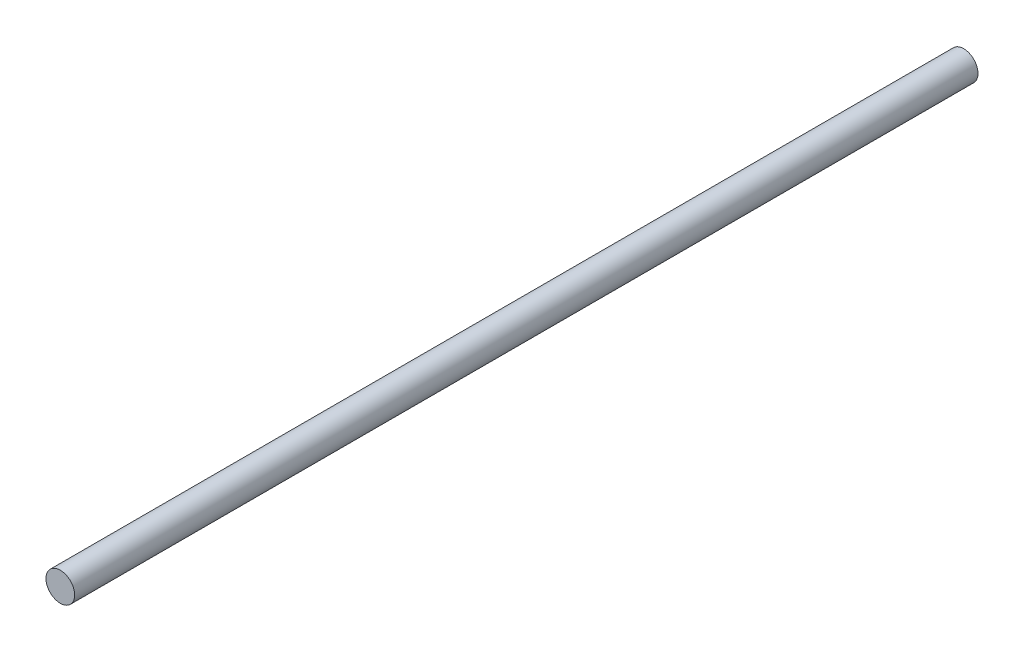
ISO-10303-21;
HEADER;
FILE_DESCRIPTION(('STEP AP214'),'2;1');
FILE_NAME('part.step','',(''),(''),'','','');
FILE_SCHEMA(('AUTOMOTIVE_DESIGN { 1 0 10303 214 1 1 1 1 }'));
ENDSEC;
DATA;
#1=APPLICATION_CONTEXT('core data for automotive mechanical design processes');
#2=APPLICATION_PROTOCOL_DEFINITION('international standard','automotive_design',2000,#1);
#3=PRODUCT_CONTEXT('',#1,'mechanical');
#4=PRODUCT('Part','Part','',(#3));
#5=PRODUCT_RELATED_PRODUCT_CATEGORY('part','',(#4));
#6=PRODUCT_DEFINITION_FORMATION('','',#4);
#7=PRODUCT_DEFINITION_CONTEXT('part definition',#1,'design');
#8=PRODUCT_DEFINITION('design','',#6,#7);
#9=PRODUCT_DEFINITION_SHAPE('','',#8);
#10=(LENGTH_UNIT() NAMED_UNIT(*) SI_UNIT(.MILLI.,.METRE.));
#11=(NAMED_UNIT(*) PLANE_ANGLE_UNIT() SI_UNIT($,.RADIAN.));
#12=(NAMED_UNIT(*) SI_UNIT($,.STERADIAN.) SOLID_ANGLE_UNIT());
#13=UNCERTAINTY_MEASURE_WITH_UNIT(LENGTH_MEASURE(1.E-05),#10,'distance_accuracy_value','');
#14=(GEOMETRIC_REPRESENTATION_CONTEXT(3) GLOBAL_UNCERTAINTY_ASSIGNED_CONTEXT((#13)) GLOBAL_UNIT_ASSIGNED_CONTEXT((#10,
#11,#12)) REPRESENTATION_CONTEXT('',''));
#15=CARTESIAN_POINT('',(0.,0.,0.));
#16=DIRECTION('',(0.,0.,1.));
#17=DIRECTION('',(1.,0.,0.));
#18=AXIS2_PLACEMENT_3D('',#15,#16,#17);
#19=CARTESIAN_POINT('',(0.,0.,200.));
#20=DIRECTION('',(0.,0.,-1.));
#21=DIRECTION('',(-1.,0.,0.));
#22=AXIS2_PLACEMENT_3D('',#19,#20,#21);
#23=CYLINDRICAL_SURFACE('',#22,3.175);
#24=CARTESIAN_POINT('',(0.,0.,200.));
#25=DIRECTION('',(0.,0.,1.));
#26=DIRECTION('',(1.,0.,0.));
#27=AXIS2_PLACEMENT_3D('',#24,#25,#26);
#28=CIRCLE('',#27,3.175);
#29=CARTESIAN_POINT('',(3.175,0.,200.));
#30=VERTEX_POINT('',#29);
#31=EDGE_CURVE('E10',#30,#30,#28,.T.);
#32=ORIENTED_EDGE('',*,*,#31,.F.);
#33=EDGE_LOOP('',(#32));
#34=FACE_BOUND('',#33,.T.);
#35=CARTESIAN_POINT('',(0.,0.,0.));
#36=DIRECTION('',(0.,0.,1.));
#37=DIRECTION('',(1.,0.,0.));
#38=AXIS2_PLACEMENT_3D('',#35,#36,#37);
#39=CIRCLE('',#38,3.175);
#40=CARTESIAN_POINT('',(3.175,0.,0.));
#41=VERTEX_POINT('',#40);
#42=EDGE_CURVE('E35',#41,#41,#39,.T.);
#43=ORIENTED_EDGE('',*,*,#42,.T.);
#44=EDGE_LOOP('',(#43));
#45=FACE_BOUND('',#44,.T.);
#46=ADVANCED_FACE('F32',(#34,#45),#23,.T.);
#47=CARTESIAN_POINT('',(0.,0.,200.));
#48=DIRECTION('',(0.,0.,1.));
#49=DIRECTION('',(1.,0.,0.));
#50=AXIS2_PLACEMENT_3D('',#47,#48,#49);
#51=PLANE('',#50);
#52=ORIENTED_EDGE('',*,*,#31,.T.);
#53=EDGE_LOOP('',(#52));
#54=FACE_BOUND('',#53,.T.);
#55=ADVANCED_FACE('F47',(#54),#51,.T.);
#56=CARTESIAN_POINT('',(0.,0.,0.));
#57=DIRECTION('',(0.,0.,1.));
#58=DIRECTION('',(1.,0.,0.));
#59=AXIS2_PLACEMENT_3D('',#56,#57,#58);
#60=PLANE('',#59);
#61=ORIENTED_EDGE('',*,*,#42,.F.);
#62=EDGE_LOOP('',(#61));
#63=FACE_BOUND('',#62,.T.);
#64=ADVANCED_FACE('F45',(#63),#60,.F.);
#65=CLOSED_SHELL('',(#46,#55,#64));
#66=MANIFOLD_SOLID_BREP('B2',#65);
#67=ADVANCED_BREP_SHAPE_REPRESENTATION('',(#18,#66),#14);
#68=SHAPE_DEFINITION_REPRESENTATION(#9,#67);
ENDSEC;
END-ISO-10303-21;
